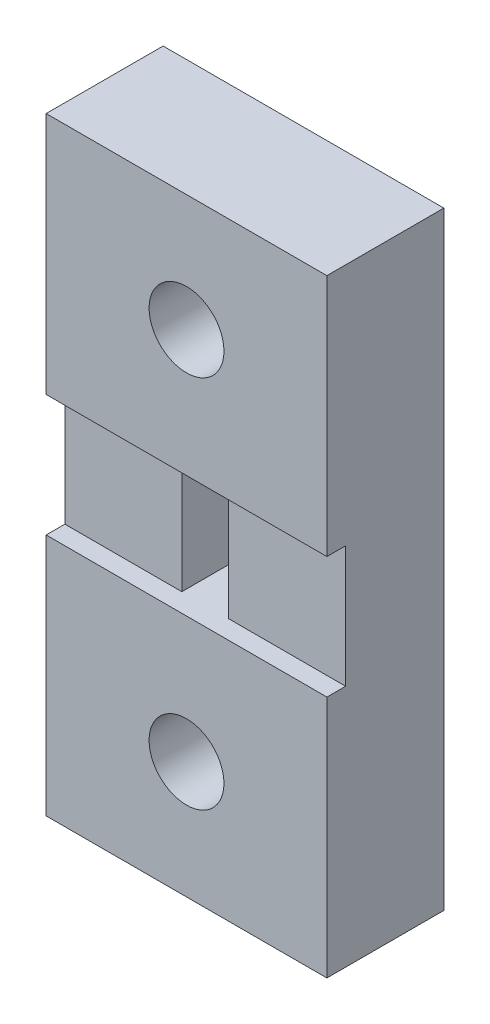
ISO-10303-21;
HEADER;
FILE_DESCRIPTION(('STEP AP214'),'2;1');
FILE_NAME('part.step','',(''),(''),'','','');
FILE_SCHEMA(('AUTOMOTIVE_DESIGN { 1 0 10303 214 1 1 1 1 }'));
ENDSEC;
DATA;
#1=APPLICATION_CONTEXT('core data for automotive mechanical design processes');
#2=APPLICATION_PROTOCOL_DEFINITION('international standard','automotive_design',2000,#1);
#3=PRODUCT_CONTEXT('',#1,'mechanical');
#4=PRODUCT('Part','Part','',(#3));
#5=PRODUCT_RELATED_PRODUCT_CATEGORY('part','',(#4));
#6=PRODUCT_DEFINITION_FORMATION('','',#4);
#7=PRODUCT_DEFINITION_CONTEXT('part definition',#1,'design');
#8=PRODUCT_DEFINITION('design','',#6,#7);
#9=PRODUCT_DEFINITION_SHAPE('','',#8);
#10=(LENGTH_UNIT() NAMED_UNIT(*) SI_UNIT(.MILLI.,.METRE.));
#11=(NAMED_UNIT(*) PLANE_ANGLE_UNIT() SI_UNIT($,.RADIAN.));
#12=(NAMED_UNIT(*) SI_UNIT($,.STERADIAN.) SOLID_ANGLE_UNIT());
#13=UNCERTAINTY_MEASURE_WITH_UNIT(LENGTH_MEASURE(1.E-05),#10,'distance_accuracy_value','');
#14=(GEOMETRIC_REPRESENTATION_CONTEXT(3) GLOBAL_UNCERTAINTY_ASSIGNED_CONTEXT((#13)) GLOBAL_UNIT_ASSIGNED_CONTEXT((#10,
#11,#12)) REPRESENTATION_CONTEXT('',''));
#15=CARTESIAN_POINT('',(0.,0.,0.));
#16=DIRECTION('',(0.,0.,1.));
#17=DIRECTION('',(1.,0.,0.));
#18=AXIS2_PLACEMENT_3D('',#15,#16,#17);
#19=CARTESIAN_POINT('',(0.,-8.,5.));
#20=DIRECTION('',(0.,0.,-1.));
#21=DIRECTION('',(-1.,0.,0.));
#22=AXIS2_PLACEMENT_3D('',#19,#20,#21);
#23=CYLINDRICAL_SURFACE('',#22,1.6);
#24=CARTESIAN_POINT('',(0.,-8.,5.));
#25=DIRECTION('',(0.,0.,1.));
#26=DIRECTION('',(1.,0.,0.));
#27=AXIS2_PLACEMENT_3D('',#24,#25,#26);
#28=CIRCLE('',#27,1.6);
#29=CARTESIAN_POINT('',(1.6,-8.,5.));
#30=VERTEX_POINT('',#29);
#31=EDGE_CURVE('E397',#30,#30,#28,.T.);
#32=ORIENTED_EDGE('',*,*,#31,.T.);
#33=EDGE_LOOP('',(#32));
#34=FACE_BOUND('',#33,.T.);
#35=CARTESIAN_POINT('',(0.,-8.,2.5));
#36=DIRECTION('',(0.,0.,-1.));
#37=DIRECTION('',(-1.,0.,0.));
#38=AXIS2_PLACEMENT_3D('',#35,#36,#37);
#39=CIRCLE('',#38,1.6);
#40=CARTESIAN_POINT('',(-1.6,-8.,2.5));
#41=VERTEX_POINT('',#40);
#42=EDGE_CURVE('E51',#41,#41,#39,.T.);
#43=ORIENTED_EDGE('',*,*,#42,.T.);
#44=EDGE_LOOP('',(#43));
#45=FACE_BOUND('',#44,.T.);
#46=ADVANCED_FACE('F47',(#34,#45),#23,.F.);
#47=CARTESIAN_POINT('',(0.,8.,5.));
#48=DIRECTION('',(0.,0.,-1.));
#49=DIRECTION('',(-1.,0.,0.));
#50=AXIS2_PLACEMENT_3D('',#47,#48,#49);
#51=CYLINDRICAL_SURFACE('',#50,1.6);
#52=CARTESIAN_POINT('',(0.,8.,5.));
#53=DIRECTION('',(0.,0.,1.));
#54=DIRECTION('',(1.,0.,0.));
#55=AXIS2_PLACEMENT_3D('',#52,#53,#54);
#56=CIRCLE('',#55,1.6);
#57=CARTESIAN_POINT('',(1.6,8.,5.));
#58=VERTEX_POINT('',#57);
#59=EDGE_CURVE('E393',#58,#58,#56,.T.);
#60=ORIENTED_EDGE('',*,*,#59,.T.);
#61=EDGE_LOOP('',(#60));
#62=FACE_BOUND('',#61,.T.);
#63=CARTESIAN_POINT('',(0.,8.,2.5));
#64=DIRECTION('',(0.,0.,-1.));
#65=DIRECTION('',(-1.,0.,0.));
#66=AXIS2_PLACEMENT_3D('',#63,#64,#65);
#67=CIRCLE('',#66,1.6);
#68=CARTESIAN_POINT('',(-1.6,8.,2.5));
#69=VERTEX_POINT('',#68);
#70=EDGE_CURVE('E271',#69,#69,#67,.T.);
#71=ORIENTED_EDGE('',*,*,#70,.T.);
#72=EDGE_LOOP('',(#71));
#73=FACE_BOUND('',#72,.T.);
#74=ADVANCED_FACE('F576',(#62,#73),#51,.F.);
#75=CARTESIAN_POINT('',(0.,0.,5.));
#76=DIRECTION('',(0.,0.,1.));
#77=DIRECTION('',(1.,0.,0.));
#78=AXIS2_PLACEMENT_3D('',#75,#76,#77);
#79=PLANE('',#78);
#80=DIRECTION('',(1.,0.,0.));
#81=VECTOR('',#80,1.);
#82=CARTESIAN_POINT('',(0.,-2.6,5.));
#83=LINE('',#82,#81);
#84=CARTESIAN_POINT('',(-6.,-2.6,5.));
#85=VERTEX_POINT('',#84);
#86=CARTESIAN_POINT('',(6.,-2.6,5.));
#87=VERTEX_POINT('',#86);
#88=EDGE_CURVE('E386',#85,#87,#83,.T.);
#89=ORIENTED_EDGE('',*,*,#88,.F.);
#90=DIRECTION('',(0.,1.,0.));
#91=VECTOR('',#90,1.);
#92=CARTESIAN_POINT('',(-6.,0.,5.));
#93=LINE('',#92,#91);
#94=CARTESIAN_POINT('',(-6.,-13.,5.));
#95=VERTEX_POINT('',#94);
#96=EDGE_CURVE('E402',#95,#85,#93,.T.);
#97=ORIENTED_EDGE('',*,*,#96,.F.);
#98=DIRECTION('',(-1.,0.,0.));
#99=VECTOR('',#98,1.);
#100=CARTESIAN_POINT('',(0.,-13.,5.));
#101=LINE('',#100,#99);
#102=CARTESIAN_POINT('',(6.,-13.,5.));
#103=VERTEX_POINT('',#102);
#104=EDGE_CURVE('E406',#103,#95,#101,.T.);
#105=ORIENTED_EDGE('',*,*,#104,.F.);
#106=DIRECTION('',(0.,1.,0.));
#107=VECTOR('',#106,1.);
#108=CARTESIAN_POINT('',(6.,0.,5.));
#109=LINE('',#108,#107);
#110=EDGE_CURVE('E411',#103,#87,#109,.T.);
#111=ORIENTED_EDGE('',*,*,#110,.T.);
#112=EDGE_LOOP('',(#89,#97,#105,#111));
#113=FACE_BOUND('',#112,.T.);
#114=ORIENTED_EDGE('',*,*,#31,.F.);
#115=EDGE_LOOP('',(#114));
#116=FACE_BOUND('',#115,.T.);
#117=ADVANCED_FACE('F537',(#113,#116),#79,.T.);
#118=CARTESIAN_POINT('',(-6.,0.,5.));
#119=DIRECTION('',(-1.,0.,0.));
#120=DIRECTION('',(0.,0.,1.));
#121=AXIS2_PLACEMENT_3D('',#118,#119,#120);
#122=PLANE('',#121);
#123=DIRECTION('',(0.,0.,1.));
#124=VECTOR('',#123,1.);
#125=CARTESIAN_POINT('',(-6.,-2.6,4.2));
#126=LINE('',#125,#124);
#127=CARTESIAN_POINT('',(-6.,-2.6,4.2));
#128=VERTEX_POINT('',#127);
#129=EDGE_CURVE('E368',#128,#85,#126,.T.);
#130=ORIENTED_EDGE('',*,*,#129,.F.);
#131=DIRECTION('',(0.,-1.,0.));
#132=VECTOR('',#131,1.);
#133=CARTESIAN_POINT('',(-6.,-2.6,4.2));
#134=LINE('',#133,#132);
#135=CARTESIAN_POINT('',(-6.,2.6,4.2));
#136=VERTEX_POINT('',#135);
#137=EDGE_CURVE('E355',#136,#128,#134,.T.);
#138=ORIENTED_EDGE('',*,*,#137,.F.);
#139=DIRECTION('',(0.,0.,1.));
#140=VECTOR('',#139,1.);
#141=CARTESIAN_POINT('',(-6.,2.6,4.2));
#142=LINE('',#141,#140);
#143=CARTESIAN_POINT('',(-6.,2.6,5.));
#144=VERTEX_POINT('',#143);
#145=EDGE_CURVE('E372',#136,#144,#142,.T.);
#146=ORIENTED_EDGE('',*,*,#145,.T.);
#147=CARTESIAN_POINT('',(-6.,13.,5.));
#148=VERTEX_POINT('',#147);
#149=EDGE_CURVE('E401',#144,#148,#93,.T.);
#150=ORIENTED_EDGE('',*,*,#149,.T.);
#151=DIRECTION('',(0.,0.,-1.));
#152=VECTOR('',#151,1.);
#153=CARTESIAN_POINT('',(-6.,13.,5.));
#154=LINE('',#153,#152);
#155=CARTESIAN_POINT('',(-6.,13.,0.));
#156=VERTEX_POINT('',#155);
#157=EDGE_CURVE('E450',#148,#156,#154,.T.);
#158=ORIENTED_EDGE('',*,*,#157,.T.);
#159=DIRECTION('',(0.,1.,0.));
#160=VECTOR('',#159,1.);
#161=CARTESIAN_POINT('',(-6.,0.,0.));
#162=LINE('',#161,#160);
#163=CARTESIAN_POINT('',(-6.,-13.,0.));
#164=VERTEX_POINT('',#163);
#165=EDGE_CURVE('E435',#164,#156,#162,.T.);
#166=ORIENTED_EDGE('',*,*,#165,.F.);
#167=DIRECTION('',(0.,0.,-1.));
#168=VECTOR('',#167,1.);
#169=CARTESIAN_POINT('',(-6.,-13.,5.));
#170=LINE('',#169,#168);
#171=EDGE_CURVE('E11',#95,#164,#170,.T.);
#172=ORIENTED_EDGE('',*,*,#171,.F.);
#173=ORIENTED_EDGE('',*,*,#96,.T.);
#174=EDGE_LOOP('',(#130,#138,#146,#150,#158,#166,#172,#173));
#175=FACE_BOUND('',#174,.T.);
#176=ADVANCED_FACE('F520',(#175),#122,.T.);
#177=CARTESIAN_POINT('',(0.,-13.,5.));
#178=DIRECTION('',(0.,-1.,0.));
#179=DIRECTION('',(1.,0.,0.));
#180=AXIS2_PLACEMENT_3D('',#177,#178,#179);
#181=PLANE('',#180);
#182=DIRECTION('',(-1.,0.,0.));
#183=VECTOR('',#182,1.);
#184=CARTESIAN_POINT('',(0.,-13.,0.));
#185=LINE('',#184,#183);
#186=CARTESIAN_POINT('',(6.,-13.,0.));
#187=VERTEX_POINT('',#186);
#188=EDGE_CURVE('E439',#187,#164,#185,.T.);
#189=ORIENTED_EDGE('',*,*,#188,.F.);
#190=DIRECTION('',(0.,0.,-1.));
#191=VECTOR('',#190,1.);
#192=CARTESIAN_POINT('',(6.,-13.,5.));
#193=LINE('',#192,#191);
#194=EDGE_CURVE('E57',#103,#187,#193,.T.);
#195=ORIENTED_EDGE('',*,*,#194,.F.);
#196=ORIENTED_EDGE('',*,*,#104,.T.);
#197=ORIENTED_EDGE('',*,*,#171,.T.);
#198=EDGE_LOOP('',(#189,#195,#196,#197));
#199=FACE_BOUND('',#198,.T.);
#200=ADVANCED_FACE('F534',(#199),#181,.T.);
#201=CARTESIAN_POINT('',(6.,0.,5.));
#202=DIRECTION('',(-1.,0.,0.));
#203=DIRECTION('',(0.,0.,1.));
#204=AXIS2_PLACEMENT_3D('',#201,#202,#203);
#205=PLANE('',#204);
#206=DIRECTION('',(0.,1.,0.));
#207=VECTOR('',#206,1.);
#208=CARTESIAN_POINT('',(6.,-2.6,4.2));
#209=LINE('',#208,#207);
#210=CARTESIAN_POINT('',(6.,-2.6,4.2));
#211=VERTEX_POINT('',#210);
#212=CARTESIAN_POINT('',(6.,2.6,4.2));
#213=VERTEX_POINT('',#212);
#214=EDGE_CURVE('E347',#211,#213,#209,.T.);
#215=ORIENTED_EDGE('',*,*,#214,.F.);
#216=DIRECTION('',(0.,0.,1.));
#217=VECTOR('',#216,1.);
#218=CARTESIAN_POINT('',(6.,-2.6,4.2));
#219=LINE('',#218,#217);
#220=EDGE_CURVE('E363',#211,#87,#219,.T.);
#221=ORIENTED_EDGE('',*,*,#220,.T.);
#222=ORIENTED_EDGE('',*,*,#110,.F.);
#223=ORIENTED_EDGE('',*,*,#194,.T.);
#224=DIRECTION('',(0.,1.,0.));
#225=VECTOR('',#224,1.);
#226=CARTESIAN_POINT('',(6.,0.,0.));
#227=LINE('',#226,#225);
#228=CARTESIAN_POINT('',(6.,13.,0.));
#229=VERTEX_POINT('',#228);
#230=EDGE_CURVE('E443',#187,#229,#227,.T.);
#231=ORIENTED_EDGE('',*,*,#230,.T.);
#232=DIRECTION('',(0.,0.,-1.));
#233=VECTOR('',#232,1.);
#234=CARTESIAN_POINT('',(6.,13.,5.));
#235=LINE('',#234,#233);
#236=CARTESIAN_POINT('',(6.,13.,5.));
#237=VERTEX_POINT('',#236);
#238=EDGE_CURVE('E453',#237,#229,#235,.T.);
#239=ORIENTED_EDGE('',*,*,#238,.F.);
#240=CARTESIAN_POINT('',(6.,2.6,5.));
#241=VERTEX_POINT('',#240);
#242=EDGE_CURVE('E410',#241,#237,#109,.T.);
#243=ORIENTED_EDGE('',*,*,#242,.F.);
#244=DIRECTION('',(0.,0.,1.));
#245=VECTOR('',#244,1.);
#246=CARTESIAN_POINT('',(6.,2.6,4.2));
#247=LINE('',#246,#245);
#248=EDGE_CURVE('E362',#213,#241,#247,.T.);
#249=ORIENTED_EDGE('',*,*,#248,.F.);
#250=EDGE_LOOP('',(#215,#221,#222,#223,#231,#239,#243,#249));
#251=FACE_BOUND('',#250,.T.);
#252=ADVANCED_FACE('F531',(#251),#205,.F.);
#253=CARTESIAN_POINT('',(1.,0.,5.));
#254=DIRECTION('',(-1.,0.,0.));
#255=DIRECTION('',(0.,0.,1.));
#256=AXIS2_PLACEMENT_3D('',#253,#254,#255);
#257=PLANE('',#256);
#258=DIRECTION('',(0.,-1.,0.));
#259=VECTOR('',#258,1.);
#260=CARTESIAN_POINT('',(1.,0.,4.2));
#261=LINE('',#260,#259);
#262=CARTESIAN_POINT('',(1.,2.6,4.2));
#263=VERTEX_POINT('',#262);
#264=CARTESIAN_POINT('',(1.,-2.6,4.2));
#265=VERTEX_POINT('',#264);
#266=EDGE_CURVE('E382',#263,#265,#261,.T.);
#267=ORIENTED_EDGE('',*,*,#266,.F.);
#268=DIRECTION('',(0.,0.,-1.));
#269=VECTOR('',#268,1.);
#270=CARTESIAN_POINT('',(1.,2.6,5.));
#271=LINE('',#270,#269);
#272=CARTESIAN_POINT('',(1.,2.6,0.));
#273=VERTEX_POINT('',#272);
#274=EDGE_CURVE('E419',#263,#273,#271,.T.);
#275=ORIENTED_EDGE('',*,*,#274,.T.);
#276=DIRECTION('',(0.,1.,0.));
#277=VECTOR('',#276,1.);
#278=CARTESIAN_POINT('',(1.,0.,0.));
#279=LINE('',#278,#277);
#280=CARTESIAN_POINT('',(1.,-2.6,0.));
#281=VERTEX_POINT('',#280);
#282=EDGE_CURVE('E385',#281,#273,#279,.T.);
#283=ORIENTED_EDGE('',*,*,#282,.F.);
#284=DIRECTION('',(0.,0.,-1.));
#285=VECTOR('',#284,1.);
#286=CARTESIAN_POINT('',(1.,-2.6,5.));
#287=LINE('',#286,#285);
#288=EDGE_CURVE('E454',#265,#281,#287,.T.);
#289=ORIENTED_EDGE('',*,*,#288,.F.);
#290=EDGE_LOOP('',(#267,#275,#283,#289));
#291=FACE_BOUND('',#290,.T.);
#292=ADVANCED_FACE('F49',(#291),#257,.T.);
#293=CARTESIAN_POINT('',(0.,-2.6,5.));
#294=DIRECTION('',(0.,1.,0.));
#295=DIRECTION('',(0.,0.,1.));
#296=AXIS2_PLACEMENT_3D('',#293,#294,#295);
#297=PLANE('',#296);
#298=DIRECTION('',(0.,0.,-1.));
#299=VECTOR('',#298,1.);
#300=CARTESIAN_POINT('',(-1.,-2.6,5.));
#301=LINE('',#300,#299);
#302=CARTESIAN_POINT('',(-0.999999999999999,-2.6,4.2));
#303=VERTEX_POINT('',#302);
#304=CARTESIAN_POINT('',(-1.,-2.6,0.));
#305=VERTEX_POINT('',#304);
#306=EDGE_CURVE('E465',#303,#305,#301,.T.);
#307=ORIENTED_EDGE('',*,*,#306,.F.);
#308=DIRECTION('',(1.,0.,0.));
#309=VECTOR('',#308,1.);
#310=CARTESIAN_POINT('',(-6.,-2.6,4.2));
#311=LINE('',#310,#309);
#312=EDGE_CURVE('E359',#128,#303,#311,.T.);
#313=ORIENTED_EDGE('',*,*,#312,.F.);
#314=ORIENTED_EDGE('',*,*,#129,.T.);
#315=ORIENTED_EDGE('',*,*,#88,.T.);
#316=ORIENTED_EDGE('',*,*,#220,.F.);
#317=EDGE_CURVE('E358',#265,#211,#311,.T.);
#318=ORIENTED_EDGE('',*,*,#317,.F.);
#319=ORIENTED_EDGE('',*,*,#288,.T.);
#320=DIRECTION('',(1.,0.,0.));
#321=VECTOR('',#320,1.);
#322=CARTESIAN_POINT('',(0.,-2.6,0.));
#323=LINE('',#322,#321);
#324=EDGE_CURVE('E423',#305,#281,#323,.T.);
#325=ORIENTED_EDGE('',*,*,#324,.F.);
#326=EDGE_LOOP('',(#307,#313,#314,#315,#316,#318,#319,#325));
#327=FACE_BOUND('',#326,.T.);
#328=ADVANCED_FACE('F543',(#327),#297,.T.);
#329=CARTESIAN_POINT('',(-1.,0.,5.));
#330=DIRECTION('',(-1.,0.,0.));
#331=DIRECTION('',(0.,0.,1.));
#332=AXIS2_PLACEMENT_3D('',#329,#330,#331);
#333=PLANE('',#332);
#334=DIRECTION('',(0.,0.,-1.));
#335=VECTOR('',#334,1.);
#336=CARTESIAN_POINT('',(-1.,2.6,5.));
#337=LINE('',#336,#335);
#338=CARTESIAN_POINT('',(-0.999999999999999,2.6,4.2));
#339=VERTEX_POINT('',#338);
#340=CARTESIAN_POINT('',(-1.,2.6,0.));
#341=VERTEX_POINT('',#340);
#342=EDGE_CURVE('E462',#339,#341,#337,.T.);
#343=ORIENTED_EDGE('',*,*,#342,.F.);
#344=DIRECTION('',(0.,-1.,0.));
#345=VECTOR('',#344,1.);
#346=CARTESIAN_POINT('',(-1.,0.,4.2));
#347=LINE('',#346,#345);
#348=EDGE_CURVE('E367',#339,#303,#347,.T.);
#349=ORIENTED_EDGE('',*,*,#348,.T.);
#350=ORIENTED_EDGE('',*,*,#306,.T.);
#351=DIRECTION('',(0.,1.,0.));
#352=VECTOR('',#351,1.);
#353=CARTESIAN_POINT('',(-1.,0.,0.));
#354=LINE('',#353,#352);
#355=EDGE_CURVE('E427',#305,#341,#354,.T.);
#356=ORIENTED_EDGE('',*,*,#355,.T.);
#357=EDGE_LOOP('',(#343,#349,#350,#356));
#358=FACE_BOUND('',#357,.T.);
#359=ADVANCED_FACE('F550',(#358),#333,.F.);
#360=CARTESIAN_POINT('',(0.,2.6,5.));
#361=DIRECTION('',(0.,1.,0.));
#362=DIRECTION('',(0.,0.,1.));
#363=AXIS2_PLACEMENT_3D('',#360,#361,#362);
#364=PLANE('',#363);
#365=ORIENTED_EDGE('',*,*,#274,.F.);
#366=DIRECTION('',(-1.,0.,0.));
#367=VECTOR('',#366,1.);
#368=CARTESIAN_POINT('',(-6.,2.6,4.2));
#369=LINE('',#368,#367);
#370=EDGE_CURVE('E352',#213,#263,#369,.T.);
#371=ORIENTED_EDGE('',*,*,#370,.F.);
#372=ORIENTED_EDGE('',*,*,#248,.T.);
#373=DIRECTION('',(1.,0.,0.));
#374=VECTOR('',#373,1.);
#375=CARTESIAN_POINT('',(0.,2.6,5.));
#376=LINE('',#375,#374);
#377=EDGE_CURVE('E389',#144,#241,#376,.T.);
#378=ORIENTED_EDGE('',*,*,#377,.F.);
#379=ORIENTED_EDGE('',*,*,#145,.F.);
#380=EDGE_CURVE('E351',#339,#136,#369,.T.);
#381=ORIENTED_EDGE('',*,*,#380,.F.);
#382=ORIENTED_EDGE('',*,*,#342,.T.);
#383=DIRECTION('',(1.,0.,0.));
#384=VECTOR('',#383,1.);
#385=CARTESIAN_POINT('',(0.,2.6,0.));
#386=LINE('',#385,#384);
#387=EDGE_CURVE('E431',#341,#273,#386,.T.);
#388=ORIENTED_EDGE('',*,*,#387,.T.);
#389=EDGE_LOOP('',(#365,#371,#372,#378,#379,#381,#382,#388));
#390=FACE_BOUND('',#389,.T.);
#391=ADVANCED_FACE('F554',(#390),#364,.F.);
#392=CARTESIAN_POINT('',(0.,13.,5.));
#393=DIRECTION('',(0.,-1.,0.));
#394=DIRECTION('',(0.,0.,-1.));
#395=AXIS2_PLACEMENT_3D('',#392,#393,#394);
#396=PLANE('',#395);
#397=DIRECTION('',(-1.,0.,0.));
#398=VECTOR('',#397,1.);
#399=CARTESIAN_POINT('',(0.,13.,0.));
#400=LINE('',#399,#398);
#401=EDGE_CURVE('E390',#229,#156,#400,.T.);
#402=ORIENTED_EDGE('',*,*,#401,.T.);
#403=ORIENTED_EDGE('',*,*,#157,.F.);
#404=DIRECTION('',(-1.,0.,0.));
#405=VECTOR('',#404,1.);
#406=CARTESIAN_POINT('',(0.,13.,5.));
#407=LINE('',#406,#405);
#408=EDGE_CURVE('E415',#237,#148,#407,.T.);
#409=ORIENTED_EDGE('',*,*,#408,.F.);
#410=ORIENTED_EDGE('',*,*,#238,.T.);
#411=EDGE_LOOP('',(#402,#403,#409,#410));
#412=FACE_BOUND('',#411,.T.);
#413=ADVANCED_FACE('F526',(#412),#396,.F.);
#414=ORIENTED_EDGE('',*,*,#377,.T.);
#415=ORIENTED_EDGE('',*,*,#242,.T.);
#416=ORIENTED_EDGE('',*,*,#408,.T.);
#417=ORIENTED_EDGE('',*,*,#149,.F.);
#418=EDGE_LOOP('',(#414,#415,#416,#417));
#419=FACE_BOUND('',#418,.T.);
#420=ORIENTED_EDGE('',*,*,#59,.F.);
#421=EDGE_LOOP('',(#420));
#422=FACE_BOUND('',#421,.T.);
#423=ADVANCED_FACE('F509',(#419,#422),#79,.T.);
#424=CARTESIAN_POINT('',(0.,0.,0.));
#425=DIRECTION('',(0.,0.,1.));
#426=DIRECTION('',(1.,0.,0.));
#427=AXIS2_PLACEMENT_3D('',#424,#425,#426);
#428=PLANE('',#427);
#429=DIRECTION('',(1.,0.,0.));
#430=VECTOR('',#429,1.);
#431=CARTESIAN_POINT('',(-1.73205080756888,11.,0.));
#432=LINE('',#431,#430);
#433=CARTESIAN_POINT('',(-1.73205080756888,11.,0.));
#434=VERTEX_POINT('',#433);
#435=CARTESIAN_POINT('',(1.73205080756888,11.,0.));
#436=VERTEX_POINT('',#435);
#437=EDGE_CURVE('E254',#434,#436,#432,.T.);
#438=ORIENTED_EDGE('',*,*,#437,.F.);
#439=DIRECTION('',(0.5,0.866025403784439,0.));
#440=VECTOR('',#439,1.);
#441=CARTESIAN_POINT('',(-3.46410161513776,8.,0.));
#442=LINE('',#441,#440);
#443=CARTESIAN_POINT('',(-3.46410161513776,8.,0.));
#444=VERTEX_POINT('',#443);
#445=EDGE_CURVE('E65',#444,#434,#442,.T.);
#446=ORIENTED_EDGE('',*,*,#445,.F.);
#447=DIRECTION('',(-0.5,0.866025403784438,0.));
#448=VECTOR('',#447,1.);
#449=CARTESIAN_POINT('',(-1.73205080756888,5.,0.));
#450=LINE('',#449,#448);
#451=CARTESIAN_POINT('',(-1.73205080756888,5.,0.));
#452=VERTEX_POINT('',#451);
#453=EDGE_CURVE('E234',#452,#444,#450,.T.);
#454=ORIENTED_EDGE('',*,*,#453,.F.);
#455=DIRECTION('',(-1.,0.,0.));
#456=VECTOR('',#455,1.);
#457=CARTESIAN_POINT('',(1.73205080756888,5.,0.));
#458=LINE('',#457,#456);
#459=CARTESIAN_POINT('',(1.73205080756888,5.,0.));
#460=VERTEX_POINT('',#459);
#461=EDGE_CURVE('E238',#460,#452,#458,.T.);
#462=ORIENTED_EDGE('',*,*,#461,.F.);
#463=DIRECTION('',(-0.5,-0.866025403784439,0.));
#464=VECTOR('',#463,1.);
#465=CARTESIAN_POINT('',(3.46410161513776,8.,0.));
#466=LINE('',#465,#464);
#467=CARTESIAN_POINT('',(3.46410161513776,8.,0.));
#468=VERTEX_POINT('',#467);
#469=EDGE_CURVE('E261',#468,#460,#466,.T.);
#470=ORIENTED_EDGE('',*,*,#469,.F.);
#471=DIRECTION('',(0.5,-0.866025403784438,0.));
#472=VECTOR('',#471,1.);
#473=CARTESIAN_POINT('',(1.73205080756888,11.,0.));
#474=LINE('',#473,#472);
#475=EDGE_CURVE('E257',#436,#468,#474,.T.);
#476=ORIENTED_EDGE('',*,*,#475,.F.);
#477=EDGE_LOOP('',(#438,#446,#454,#462,#470,#476));
#478=FACE_BOUND('',#477,.T.);
#479=DIRECTION('',(1.,0.,0.));
#480=VECTOR('',#479,1.);
#481=CARTESIAN_POINT('',(-1.73205080756888,-5.,0.));
#482=LINE('',#481,#480);
#483=CARTESIAN_POINT('',(-1.73205080756888,-5.,0.));
#484=VERTEX_POINT('',#483);
#485=CARTESIAN_POINT('',(1.73205080756888,-5.,0.));
#486=VERTEX_POINT('',#485);
#487=EDGE_CURVE('E319',#484,#486,#482,.T.);
#488=ORIENTED_EDGE('',*,*,#487,.F.);
#489=DIRECTION('',(0.5,0.866025403784438,0.));
#490=VECTOR('',#489,1.);
#491=CARTESIAN_POINT('',(-3.46410161513776,-8.,0.));
#492=LINE('',#491,#490);
#493=CARTESIAN_POINT('',(-3.46410161513776,-8.,0.));
#494=VERTEX_POINT('',#493);
#495=EDGE_CURVE('E73',#494,#484,#492,.T.);
#496=ORIENTED_EDGE('',*,*,#495,.F.);
#497=DIRECTION('',(-0.5,0.866025403784439,0.));
#498=VECTOR('',#497,1.);
#499=CARTESIAN_POINT('',(-1.73205080756888,-11.,0.));
#500=LINE('',#499,#498);
#501=CARTESIAN_POINT('',(-1.73205080756888,-11.,0.));
#502=VERTEX_POINT('',#501);
#503=EDGE_CURVE('E302',#502,#494,#500,.T.);
#504=ORIENTED_EDGE('',*,*,#503,.F.);
#505=DIRECTION('',(-1.,0.,0.));
#506=VECTOR('',#505,1.);
#507=CARTESIAN_POINT('',(1.73205080756888,-11.,0.));
#508=LINE('',#507,#506);
#509=CARTESIAN_POINT('',(1.73205080756888,-11.,0.));
#510=VERTEX_POINT('',#509);
#511=EDGE_CURVE('E306',#510,#502,#508,.T.);
#512=ORIENTED_EDGE('',*,*,#511,.F.);
#513=DIRECTION('',(-0.5,-0.866025403784439,0.));
#514=VECTOR('',#513,1.);
#515=CARTESIAN_POINT('',(3.46410161513776,-8.,0.));
#516=LINE('',#515,#514);
#517=CARTESIAN_POINT('',(3.46410161513776,-8.,0.));
#518=VERTEX_POINT('',#517);
#519=EDGE_CURVE('E311',#518,#510,#516,.T.);
#520=ORIENTED_EDGE('',*,*,#519,.F.);
#521=DIRECTION('',(0.5,-0.866025403784439,0.));
#522=VECTOR('',#521,1.);
#523=CARTESIAN_POINT('',(1.73205080756888,-5.,0.));
#524=LINE('',#523,#522);
#525=EDGE_CURVE('E315',#486,#518,#524,.T.);
#526=ORIENTED_EDGE('',*,*,#525,.F.);
#527=EDGE_LOOP('',(#488,#496,#504,#512,#520,#526));
#528=FACE_BOUND('',#527,.T.);
#529=ORIENTED_EDGE('',*,*,#282,.T.);
#530=ORIENTED_EDGE('',*,*,#387,.F.);
#531=ORIENTED_EDGE('',*,*,#355,.F.);
#532=ORIENTED_EDGE('',*,*,#324,.T.);
#533=EDGE_LOOP('',(#529,#530,#531,#532));
#534=FACE_BOUND('',#533,.T.);
#535=ORIENTED_EDGE('',*,*,#165,.T.);
#536=ORIENTED_EDGE('',*,*,#401,.F.);
#537=ORIENTED_EDGE('',*,*,#230,.F.);
#538=ORIENTED_EDGE('',*,*,#188,.T.);
#539=EDGE_LOOP('',(#535,#536,#537,#538));
#540=FACE_BOUND('',#539,.T.);
#541=ADVANCED_FACE('F505',(#478,#528,#534,#540),#428,.F.);
#542=CARTESIAN_POINT('',(0.,0.,4.2));
#543=DIRECTION('',(0.,0.,-1.));
#544=DIRECTION('',(-1.,0.,0.));
#545=AXIS2_PLACEMENT_3D('',#542,#543,#544);
#546=PLANE('',#545);
#547=ORIENTED_EDGE('',*,*,#380,.T.);
#548=ORIENTED_EDGE('',*,*,#137,.T.);
#549=ORIENTED_EDGE('',*,*,#312,.T.);
#550=ORIENTED_EDGE('',*,*,#348,.F.);
#551=EDGE_LOOP('',(#547,#548,#549,#550));
#552=FACE_BOUND('',#551,.T.);
#553=ADVANCED_FACE('F508',(#552),#546,.F.);
#554=ORIENTED_EDGE('',*,*,#266,.T.);
#555=ORIENTED_EDGE('',*,*,#317,.T.);
#556=ORIENTED_EDGE('',*,*,#214,.T.);
#557=ORIENTED_EDGE('',*,*,#370,.T.);
#558=EDGE_LOOP('',(#554,#555,#556,#557));
#559=FACE_BOUND('',#558,.T.);
#560=ADVANCED_FACE('F565',(#559),#546,.F.);
#561=CARTESIAN_POINT('',(-3.46410161513776,-8.,2.5));
#562=DIRECTION('',(-0.866025403784438,0.5,0.));
#563=DIRECTION('',(-0.5,-0.866025403784439,0.));
#564=AXIS2_PLACEMENT_3D('',#561,#562,#563);
#565=PLANE('',#564);
#566=ORIENTED_EDGE('',*,*,#495,.T.);
#567=DIRECTION('',(0.,0.,-1.));
#568=VECTOR('',#567,1.);
#569=CARTESIAN_POINT('',(-1.73205080756888,-5.,2.5));
#570=LINE('',#569,#568);
#571=CARTESIAN_POINT('',(-1.73205080756888,-5.,2.5));
#572=VERTEX_POINT('',#571);
#573=EDGE_CURVE('E283',#572,#484,#570,.T.);
#574=ORIENTED_EDGE('',*,*,#573,.F.);
#575=DIRECTION('',(0.5,0.866025403784438,0.));
#576=VECTOR('',#575,1.);
#577=CARTESIAN_POINT('',(-3.46410161513776,-8.,2.5));
#578=LINE('',#577,#576);
#579=CARTESIAN_POINT('',(-3.46410161513776,-8.,2.5));
#580=VERTEX_POINT('',#579);
#581=EDGE_CURVE('E307',#580,#572,#578,.T.);
#582=ORIENTED_EDGE('',*,*,#581,.F.);
#583=DIRECTION('',(0.,0.,-1.));
#584=VECTOR('',#583,1.);
#585=CARTESIAN_POINT('',(-3.46410161513776,-8.,2.5));
#586=LINE('',#585,#584);
#587=EDGE_CURVE('E299',#580,#494,#586,.T.);
#588=ORIENTED_EDGE('',*,*,#587,.T.);
#589=EDGE_LOOP('',(#566,#574,#582,#588));
#590=FACE_BOUND('',#589,.T.);
#591=ADVANCED_FACE('F486',(#590),#565,.F.);
#592=CARTESIAN_POINT('',(-1.73205080756888,-11.,2.5));
#593=DIRECTION('',(-0.866025403784439,-0.5,0.));
#594=DIRECTION('',(0.5,-0.866025403784439,0.));
#595=AXIS2_PLACEMENT_3D('',#592,#593,#594);
#596=PLANE('',#595);
#597=ORIENTED_EDGE('',*,*,#503,.T.);
#598=ORIENTED_EDGE('',*,*,#587,.F.);
#599=DIRECTION('',(-0.5,0.866025403784439,0.));
#600=VECTOR('',#599,1.);
#601=CARTESIAN_POINT('',(-1.73205080756888,-11.,2.5));
#602=LINE('',#601,#600);
#603=CARTESIAN_POINT('',(-1.73205080756888,-11.,2.5));
#604=VERTEX_POINT('',#603);
#605=EDGE_CURVE('E286',#604,#580,#602,.T.);
#606=ORIENTED_EDGE('',*,*,#605,.F.);
#607=DIRECTION('',(0.,0.,-1.));
#608=VECTOR('',#607,1.);
#609=CARTESIAN_POINT('',(-1.73205080756888,-11.,2.5));
#610=LINE('',#609,#608);
#611=EDGE_CURVE('E296',#604,#502,#610,.T.);
#612=ORIENTED_EDGE('',*,*,#611,.T.);
#613=EDGE_LOOP('',(#597,#598,#606,#612));
#614=FACE_BOUND('',#613,.T.);
#615=ADVANCED_FACE('F503',(#614),#596,.F.);
#616=CARTESIAN_POINT('',(1.73205080756888,-11.,2.5));
#617=DIRECTION('',(0.,-1.,0.));
#618=DIRECTION('',(0.,0.,-1.));
#619=AXIS2_PLACEMENT_3D('',#616,#617,#618);
#620=PLANE('',#619);
#621=ORIENTED_EDGE('',*,*,#511,.T.);
#622=ORIENTED_EDGE('',*,*,#611,.F.);
#623=DIRECTION('',(-1.,0.,0.));
#624=VECTOR('',#623,1.);
#625=CARTESIAN_POINT('',(1.73205080756888,-11.,2.5));
#626=LINE('',#625,#624);
#627=CARTESIAN_POINT('',(1.73205080756888,-11.,2.5));
#628=VERTEX_POINT('',#627);
#629=EDGE_CURVE('E328',#628,#604,#626,.T.);
#630=ORIENTED_EDGE('',*,*,#629,.F.);
#631=DIRECTION('',(0.,0.,-1.));
#632=VECTOR('',#631,1.);
#633=CARTESIAN_POINT('',(1.73205080756888,-11.,2.5));
#634=LINE('',#633,#632);
#635=EDGE_CURVE('E293',#628,#510,#634,.T.);
#636=ORIENTED_EDGE('',*,*,#635,.T.);
#637=EDGE_LOOP('',(#621,#622,#630,#636));
#638=FACE_BOUND('',#637,.T.);
#639=ADVANCED_FACE('F500',(#638),#620,.F.);
#640=CARTESIAN_POINT('',(3.46410161513776,-8.,2.5));
#641=DIRECTION('',(0.866025403784439,-0.5,0.));
#642=DIRECTION('',(0.5,0.866025403784439,0.));
#643=AXIS2_PLACEMENT_3D('',#640,#641,#642);
#644=PLANE('',#643);
#645=ORIENTED_EDGE('',*,*,#519,.T.);
#646=ORIENTED_EDGE('',*,*,#635,.F.);
#647=DIRECTION('',(-0.5,-0.866025403784439,0.));
#648=VECTOR('',#647,1.);
#649=CARTESIAN_POINT('',(3.46410161513776,-8.,2.5));
#650=LINE('',#649,#648);
#651=CARTESIAN_POINT('',(3.46410161513776,-8.,2.5));
#652=VERTEX_POINT('',#651);
#653=EDGE_CURVE('E332',#652,#628,#650,.T.);
#654=ORIENTED_EDGE('',*,*,#653,.F.);
#655=DIRECTION('',(0.,0.,-1.));
#656=VECTOR('',#655,1.);
#657=CARTESIAN_POINT('',(3.46410161513776,-8.,2.5));
#658=LINE('',#657,#656);
#659=EDGE_CURVE('E290',#652,#518,#658,.T.);
#660=ORIENTED_EDGE('',*,*,#659,.T.);
#661=EDGE_LOOP('',(#645,#646,#654,#660));
#662=FACE_BOUND('',#661,.T.);
#663=ADVANCED_FACE('F496',(#662),#644,.F.);
#664=CARTESIAN_POINT('',(1.73205080756888,-5.,2.5));
#665=DIRECTION('',(0.866025403784439,0.5,0.));
#666=DIRECTION('',(-0.5,0.866025403784439,0.));
#667=AXIS2_PLACEMENT_3D('',#664,#665,#666);
#668=PLANE('',#667);
#669=ORIENTED_EDGE('',*,*,#525,.T.);
#670=ORIENTED_EDGE('',*,*,#659,.F.);
#671=DIRECTION('',(0.5,-0.866025403784439,0.));
#672=VECTOR('',#671,1.);
#673=CARTESIAN_POINT('',(1.73205080756888,-5.,2.5));
#674=LINE('',#673,#672);
#675=CARTESIAN_POINT('',(1.73205080756888,-5.,2.5));
#676=VERTEX_POINT('',#675);
#677=EDGE_CURVE('E336',#676,#652,#674,.T.);
#678=ORIENTED_EDGE('',*,*,#677,.F.);
#679=DIRECTION('',(0.,0.,-1.));
#680=VECTOR('',#679,1.);
#681=CARTESIAN_POINT('',(1.73205080756888,-5.,2.5));
#682=LINE('',#681,#680);
#683=EDGE_CURVE('E287',#676,#486,#682,.T.);
#684=ORIENTED_EDGE('',*,*,#683,.T.);
#685=EDGE_LOOP('',(#669,#670,#678,#684));
#686=FACE_BOUND('',#685,.T.);
#687=ADVANCED_FACE('F492',(#686),#668,.F.);
#688=CARTESIAN_POINT('',(-1.73205080756888,-5.,2.5));
#689=DIRECTION('',(0.,1.,0.));
#690=DIRECTION('',(0.,0.,1.));
#691=AXIS2_PLACEMENT_3D('',#688,#689,#690);
#692=PLANE('',#691);
#693=ORIENTED_EDGE('',*,*,#487,.T.);
#694=ORIENTED_EDGE('',*,*,#683,.F.);
#695=DIRECTION('',(1.,0.,0.));
#696=VECTOR('',#695,1.);
#697=CARTESIAN_POINT('',(-1.73205080756888,-5.,2.5));
#698=LINE('',#697,#696);
#699=EDGE_CURVE('E340',#572,#676,#698,.T.);
#700=ORIENTED_EDGE('',*,*,#699,.F.);
#701=ORIENTED_EDGE('',*,*,#573,.T.);
#702=EDGE_LOOP('',(#693,#694,#700,#701));
#703=FACE_BOUND('',#702,.T.);
#704=ADVANCED_FACE('F481',(#703),#692,.F.);
#705=CARTESIAN_POINT('',(0.,0.,2.5));
#706=DIRECTION('',(0.,0.,-1.));
#707=DIRECTION('',(-1.,0.,0.));
#708=AXIS2_PLACEMENT_3D('',#705,#706,#707);
#709=PLANE('',#708);
#710=ORIENTED_EDGE('',*,*,#42,.F.);
#711=EDGE_LOOP('',(#710));
#712=FACE_BOUND('',#711,.T.);
#713=ORIENTED_EDGE('',*,*,#581,.T.);
#714=ORIENTED_EDGE('',*,*,#699,.T.);
#715=ORIENTED_EDGE('',*,*,#677,.T.);
#716=ORIENTED_EDGE('',*,*,#653,.T.);
#717=ORIENTED_EDGE('',*,*,#629,.T.);
#718=ORIENTED_EDGE('',*,*,#605,.T.);
#719=EDGE_LOOP('',(#713,#714,#715,#716,#717,#718));
#720=FACE_BOUND('',#719,.T.);
#721=ADVANCED_FACE('F478',(#712,#720),#709,.T.);
#722=CARTESIAN_POINT('',(-3.46410161513776,8.,2.5));
#723=DIRECTION('',(-0.866025403784439,0.5,0.));
#724=DIRECTION('',(-0.5,-0.866025403784439,0.));
#725=AXIS2_PLACEMENT_3D('',#722,#723,#724);
#726=PLANE('',#725);
#727=ORIENTED_EDGE('',*,*,#445,.T.);
#728=DIRECTION('',(0.,0.,-1.));
#729=VECTOR('',#728,1.);
#730=CARTESIAN_POINT('',(-1.73205080756888,11.,2.5));
#731=LINE('',#730,#729);
#732=CARTESIAN_POINT('',(-1.73205080756888,11.,2.5));
#733=VERTEX_POINT('',#732);
#734=EDGE_CURVE('E208',#733,#434,#731,.T.);
#735=ORIENTED_EDGE('',*,*,#734,.F.);
#736=DIRECTION('',(0.5,0.866025403784439,0.));
#737=VECTOR('',#736,1.);
#738=CARTESIAN_POINT('',(-3.46410161513776,8.,2.5));
#739=LINE('',#738,#737);
#740=CARTESIAN_POINT('',(-3.46410161513776,8.,2.5));
#741=VERTEX_POINT('',#740);
#742=EDGE_CURVE('E212',#741,#733,#739,.T.);
#743=ORIENTED_EDGE('',*,*,#742,.F.);
#744=DIRECTION('',(0.,0.,-1.));
#745=VECTOR('',#744,1.);
#746=CARTESIAN_POINT('',(-3.46410161513776,8.,2.5));
#747=LINE('',#746,#745);
#748=EDGE_CURVE('E268',#741,#444,#747,.T.);
#749=ORIENTED_EDGE('',*,*,#748,.T.);
#750=EDGE_LOOP('',(#727,#735,#743,#749));
#751=FACE_BOUND('',#750,.T.);
#752=ADVANCED_FACE('F210',(#751),#726,.F.);
#753=CARTESIAN_POINT('',(-1.73205080756888,5.,2.5));
#754=DIRECTION('',(-0.866025403784438,-0.5,0.));
#755=DIRECTION('',(0.5,-0.866025403784439,0.));
#756=AXIS2_PLACEMENT_3D('',#753,#754,#755);
#757=PLANE('',#756);
#758=ORIENTED_EDGE('',*,*,#453,.T.);
#759=ORIENTED_EDGE('',*,*,#748,.F.);
#760=DIRECTION('',(-0.5,0.866025403784438,0.));
#761=VECTOR('',#760,1.);
#762=CARTESIAN_POINT('',(-1.73205080756888,5.,2.5));
#763=LINE('',#762,#761);
#764=CARTESIAN_POINT('',(-1.73205080756888,5.,2.5));
#765=VERTEX_POINT('',#764);
#766=EDGE_CURVE('E219',#765,#741,#763,.T.);
#767=ORIENTED_EDGE('',*,*,#766,.F.);
#768=DIRECTION('',(0.,0.,-1.));
#769=VECTOR('',#768,1.);
#770=CARTESIAN_POINT('',(-1.73205080756888,5.,2.5));
#771=LINE('',#770,#769);
#772=EDGE_CURVE('E272',#765,#452,#771,.T.);
#773=ORIENTED_EDGE('',*,*,#772,.T.);
#774=EDGE_LOOP('',(#758,#759,#767,#773));
#775=FACE_BOUND('',#774,.T.);
#776=ADVANCED_FACE('F695',(#775),#757,.F.);
#777=CARTESIAN_POINT('',(1.73205080756888,5.,2.5));
#778=DIRECTION('',(0.,-1.,0.));
#779=DIRECTION('',(1.,0.,0.));
#780=AXIS2_PLACEMENT_3D('',#777,#778,#779);
#781=PLANE('',#780);
#782=ORIENTED_EDGE('',*,*,#461,.T.);
#783=ORIENTED_EDGE('',*,*,#772,.F.);
#784=DIRECTION('',(-1.,0.,0.));
#785=VECTOR('',#784,1.);
#786=CARTESIAN_POINT('',(1.73205080756888,5.,2.5));
#787=LINE('',#786,#785);
#788=CARTESIAN_POINT('',(1.73205080756888,5.,2.5));
#789=VERTEX_POINT('',#788);
#790=EDGE_CURVE('E247',#789,#765,#787,.T.);
#791=ORIENTED_EDGE('',*,*,#790,.F.);
#792=DIRECTION('',(0.,0.,-1.));
#793=VECTOR('',#792,1.);
#794=CARTESIAN_POINT('',(1.73205080756888,5.,2.5));
#795=LINE('',#794,#793);
#796=EDGE_CURVE('E275',#789,#460,#795,.T.);
#797=ORIENTED_EDGE('',*,*,#796,.T.);
#798=EDGE_LOOP('',(#782,#783,#791,#797));
#799=FACE_BOUND('',#798,.T.);
#800=ADVANCED_FACE('F704',(#799),#781,.F.);
#801=CARTESIAN_POINT('',(3.46410161513776,8.,2.5));
#802=DIRECTION('',(0.866025403784439,-0.5,0.));
#803=DIRECTION('',(0.5,0.866025403784439,0.));
#804=AXIS2_PLACEMENT_3D('',#801,#802,#803);
#805=PLANE('',#804);
#806=ORIENTED_EDGE('',*,*,#469,.T.);
#807=ORIENTED_EDGE('',*,*,#796,.F.);
#808=DIRECTION('',(-0.5,-0.866025403784439,0.));
#809=VECTOR('',#808,1.);
#810=CARTESIAN_POINT('',(3.46410161513776,8.,2.5));
#811=LINE('',#810,#809);
#812=CARTESIAN_POINT('',(3.46410161513776,8.,2.5));
#813=VERTEX_POINT('',#812);
#814=EDGE_CURVE('E243',#813,#789,#811,.T.);
#815=ORIENTED_EDGE('',*,*,#814,.F.);
#816=DIRECTION('',(0.,0.,-1.));
#817=VECTOR('',#816,1.);
#818=CARTESIAN_POINT('',(3.46410161513776,8.,2.5));
#819=LINE('',#818,#817);
#820=EDGE_CURVE('E278',#813,#468,#819,.T.);
#821=ORIENTED_EDGE('',*,*,#820,.T.);
#822=EDGE_LOOP('',(#806,#807,#815,#821));
#823=FACE_BOUND('',#822,.T.);
#824=ADVANCED_FACE('F714',(#823),#805,.F.);
#825=CARTESIAN_POINT('',(1.73205080756888,11.,2.5));
#826=DIRECTION('',(0.866025403784438,0.5,0.));
#827=DIRECTION('',(-0.5,0.866025403784439,0.));
#828=AXIS2_PLACEMENT_3D('',#825,#826,#827);
#829=PLANE('',#828);
#830=ORIENTED_EDGE('',*,*,#475,.T.);
#831=ORIENTED_EDGE('',*,*,#820,.F.);
#832=DIRECTION('',(0.5,-0.866025403784438,0.));
#833=VECTOR('',#832,1.);
#834=CARTESIAN_POINT('',(1.73205080756888,11.,2.5));
#835=LINE('',#834,#833);
#836=CARTESIAN_POINT('',(1.73205080756888,11.,2.5));
#837=VERTEX_POINT('',#836);
#838=EDGE_CURVE('E228',#837,#813,#835,.T.);
#839=ORIENTED_EDGE('',*,*,#838,.F.);
#840=DIRECTION('',(0.,0.,-1.));
#841=VECTOR('',#840,1.);
#842=CARTESIAN_POINT('',(1.73205080756888,11.,2.5));
#843=LINE('',#842,#841);
#844=EDGE_CURVE('E218',#837,#436,#843,.T.);
#845=ORIENTED_EDGE('',*,*,#844,.T.);
#846=EDGE_LOOP('',(#830,#831,#839,#845));
#847=FACE_BOUND('',#846,.T.);
#848=ADVANCED_FACE('F724',(#847),#829,.F.);
#849=CARTESIAN_POINT('',(-1.73205080756888,11.,2.5));
#850=DIRECTION('',(0.,1.,0.));
#851=DIRECTION('',(0.,0.,1.));
#852=AXIS2_PLACEMENT_3D('',#849,#850,#851);
#853=PLANE('',#852);
#854=ORIENTED_EDGE('',*,*,#437,.T.);
#855=ORIENTED_EDGE('',*,*,#844,.F.);
#856=DIRECTION('',(1.,0.,0.));
#857=VECTOR('',#856,1.);
#858=CARTESIAN_POINT('',(-1.73205080756888,11.,2.5));
#859=LINE('',#858,#857);
#860=EDGE_CURVE('E222',#733,#837,#859,.T.);
#861=ORIENTED_EDGE('',*,*,#860,.F.);
#862=ORIENTED_EDGE('',*,*,#734,.T.);
#863=EDGE_LOOP('',(#854,#855,#861,#862));
#864=FACE_BOUND('',#863,.T.);
#865=ADVANCED_FACE('F223',(#864),#853,.F.);
#866=CARTESIAN_POINT('',(0.,0.,2.5));
#867=DIRECTION('',(0.,0.,-1.));
#868=DIRECTION('',(-1.,0.,0.));
#869=AXIS2_PLACEMENT_3D('',#866,#867,#868);
#870=PLANE('',#869);
#871=ORIENTED_EDGE('',*,*,#70,.F.);
#872=EDGE_LOOP('',(#871));
#873=FACE_BOUND('',#872,.T.);
#874=ORIENTED_EDGE('',*,*,#742,.T.);
#875=ORIENTED_EDGE('',*,*,#860,.T.);
#876=ORIENTED_EDGE('',*,*,#838,.T.);
#877=ORIENTED_EDGE('',*,*,#814,.T.);
#878=ORIENTED_EDGE('',*,*,#790,.T.);
#879=ORIENTED_EDGE('',*,*,#766,.T.);
#880=EDGE_LOOP('',(#874,#875,#876,#877,#878,#879));
#881=FACE_BOUND('',#880,.T.);
#882=ADVANCED_FACE('F230',(#873,#881),#870,.T.);
#883=CLOSED_SHELL('',(#46,#74,#117,#176,#200,#252,#292,#328,#359,#391,#413,#423,#541,#553,#560,
#591,#615,#639,#663,#687,#704,#721,#752,#776,#800,#824,#848,#865,#882));
#884=MANIFOLD_SOLID_BREP('B2',#883);
#885=ADVANCED_BREP_SHAPE_REPRESENTATION('',(#18,#884),#14);
#886=SHAPE_DEFINITION_REPRESENTATION(#9,#885);
ENDSEC;
END-ISO-10303-21;
